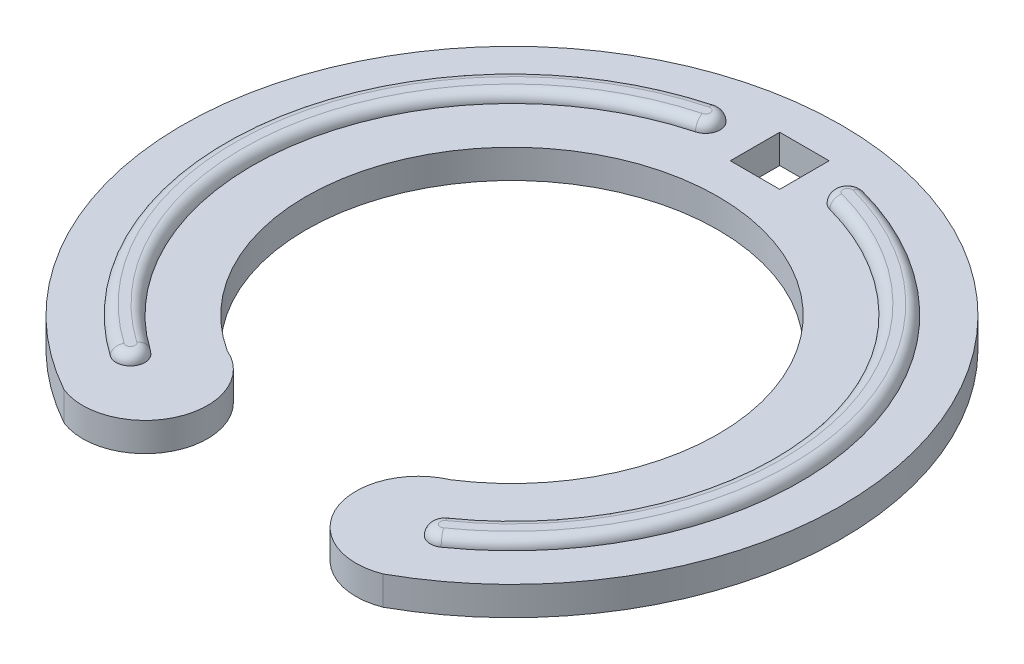
ISO-10303-21;
HEADER;
FILE_DESCRIPTION(('STEP AP214'),'2;1');
FILE_NAME('part.step','',(''),(''),'','','');
FILE_SCHEMA(('AUTOMOTIVE_DESIGN { 1 0 10303 214 1 1 1 1 }'));
ENDSEC;
DATA;
#1=APPLICATION_CONTEXT('core data for automotive mechanical design processes');
#2=APPLICATION_PROTOCOL_DEFINITION('international standard','automotive_design',2000,#1);
#3=PRODUCT_CONTEXT('',#1,'mechanical');
#4=PRODUCT('Part','Part','',(#3));
#5=PRODUCT_RELATED_PRODUCT_CATEGORY('part','',(#4));
#6=PRODUCT_DEFINITION_FORMATION('','',#4);
#7=PRODUCT_DEFINITION_CONTEXT('part definition',#1,'design');
#8=PRODUCT_DEFINITION('design','',#6,#7);
#9=PRODUCT_DEFINITION_SHAPE('','',#8);
#10=(LENGTH_UNIT() NAMED_UNIT(*) SI_UNIT(.MILLI.,.METRE.));
#11=(NAMED_UNIT(*) PLANE_ANGLE_UNIT() SI_UNIT($,.RADIAN.));
#12=(NAMED_UNIT(*) SI_UNIT($,.STERADIAN.) SOLID_ANGLE_UNIT());
#13=UNCERTAINTY_MEASURE_WITH_UNIT(LENGTH_MEASURE(1.E-05),#10,'distance_accuracy_value','');
#14=(GEOMETRIC_REPRESENTATION_CONTEXT(3) GLOBAL_UNCERTAINTY_ASSIGNED_CONTEXT((#13)) GLOBAL_UNIT_ASSIGNED_CONTEXT((#10,
#11,#12)) REPRESENTATION_CONTEXT('',''));
#15=CARTESIAN_POINT('',(0.,0.,0.));
#16=DIRECTION('',(0.,0.,1.));
#17=DIRECTION('',(1.,0.,0.));
#18=AXIS2_PLACEMENT_3D('',#15,#16,#17);
#19=CARTESIAN_POINT('',(-8.29121734406497,3.5,13.9756293222694));
#20=DIRECTION('',(0.,1.,0.));
#21=DIRECTION('',(0.,0.,1.));
#22=AXIS2_PLACEMENT_3D('',#19,#20,#21);
#23=PLANE('',#22);
#24=CARTESIAN_POINT('',(-19.0714165086721,3.5,27.2368054726091));
#25=DIRECTION('',(0.,1.,0.));
#26=DIRECTION('',(0.,0.,-1.));
#27=AXIS2_PLACEMENT_3D('',#24,#25,#26);
#28=CIRCLE('',#27,1.75);
#29=CARTESIAN_POINT('',(-20.0751752722864,3.5,28.6703215501148));
#30=VERTEX_POINT('',#29);
#31=CARTESIAN_POINT('',(-18.0676577450578,3.5,25.8032893951034));
#32=VERTEX_POINT('',#31);
#33=EDGE_CURVE('E175',#30,#32,#28,.T.);
#34=ORIENTED_EDGE('',*,*,#33,.F.);
#35=CARTESIAN_POINT('',(0.,3.5,0.));
#36=DIRECTION('',(0.,1.,0.));
#37=DIRECTION('',(0.,0.,-1.));
#38=AXIS2_PLACEMENT_3D('',#35,#36,#37);
#39=CIRCLE('',#38,35.);
#40=CARTESIAN_POINT('',(-9.05866657858826,3.5,-33.8074039201174));
#41=VERTEX_POINT('',#40);
#42=EDGE_CURVE('E185',#41,#30,#39,.T.);
#43=ORIENTED_EDGE('',*,*,#42,.F.);
#44=CARTESIAN_POINT('',(-8.60573324965875,3.5,-32.1170337241112));
#45=DIRECTION('',(0.,1.,0.));
#46=DIRECTION('',(0.,0.,-1.));
#47=AXIS2_PLACEMENT_3D('',#44,#45,#46);
#48=CIRCLE('',#47,1.75000000000001);
#49=CARTESIAN_POINT('',(-8.15279992072934,3.5,-30.4266635281053));
#50=VERTEX_POINT('',#49);
#51=EDGE_CURVE('E182',#50,#41,#48,.T.);
#52=ORIENTED_EDGE('',*,*,#51,.F.);
#53=CARTESIAN_POINT('',(0.,3.5,0.));
#54=DIRECTION('',(0.,-1.,0.));
#55=DIRECTION('',(0.,0.,-1.));
#56=AXIS2_PLACEMENT_3D('',#53,#54,#55);
#57=CIRCLE('',#56,31.5);
#58=EDGE_CURVE('E178',#32,#50,#57,.T.);
#59=ORIENTED_EDGE('',*,*,#58,.F.);
#60=EDGE_LOOP('',(#34,#43,#52,#59));
#61=FACE_BOUND('',#60,.T.);
#62=CARTESIAN_POINT('',(-16.5824346881299,3.5,27.9512586445388));
#63=DIRECTION('',(0.,1.,0.));
#64=DIRECTION('',(0.,0.,1.));
#65=AXIS2_PLACEMENT_3D('',#62,#63,#64);
#66=CIRCLE('',#65,7.57805786565989);
#67=CARTESIAN_POINT('',(-19.3649167310371,3.5,35.));
#68=VERTEX_POINT('',#67);
#69=CARTESIAN_POINT('',(-13.5646599662505,3.5,21.));
#70=VERTEX_POINT('',#69);
#71=EDGE_CURVE('E220',#68,#70,#66,.T.);
#72=ORIENTED_EDGE('',*,*,#71,.T.);
#73=CARTESIAN_POINT('',(0.,3.5,0.));
#74=DIRECTION('',(0.,-1.,0.));
#75=DIRECTION('',(0.,0.,1.));
#76=AXIS2_PLACEMENT_3D('',#73,#74,#75);
#77=CIRCLE('',#76,25.);
#78=CARTESIAN_POINT('',(13.5646599662505,3.5,21.));
#79=VERTEX_POINT('',#78);
#80=EDGE_CURVE('E223',#70,#79,#77,.T.);
#81=ORIENTED_EDGE('',*,*,#80,.T.);
#82=CARTESIAN_POINT('',(16.5824346881299,3.5,27.9512586445388));
#83=DIRECTION('',(0.,1.,0.));
#84=DIRECTION('',(0.,0.,-1.));
#85=AXIS2_PLACEMENT_3D('',#82,#83,#84);
#86=CIRCLE('',#85,7.57805786565989);
#87=CARTESIAN_POINT('',(19.3649167310371,3.5,35.));
#88=VERTEX_POINT('',#87);
#89=EDGE_CURVE('E226',#79,#88,#86,.T.);
#90=ORIENTED_EDGE('',*,*,#89,.T.);
#91=CARTESIAN_POINT('',(0.,3.5,0.));
#92=DIRECTION('',(0.,1.,0.));
#93=DIRECTION('',(0.,0.,1.));
#94=AXIS2_PLACEMENT_3D('',#91,#92,#93);
#95=CIRCLE('',#94,40.);
#96=EDGE_CURVE('E228',#88,#68,#95,.T.);
#97=ORIENTED_EDGE('',*,*,#96,.T.);
#98=EDGE_LOOP('',(#72,#81,#90,#97));
#99=FACE_BOUND('',#98,.T.);
#100=DIRECTION('',(1.,0.,0.));
#101=VECTOR('',#100,1.);
#102=CARTESIAN_POINT('',(-3.,3.5,-29.5));
#103=LINE('',#102,#101);
#104=CARTESIAN_POINT('',(-3.,3.5,-29.5));
#105=VERTEX_POINT('',#104);
#106=CARTESIAN_POINT('',(3.,3.5,-29.5));
#107=VERTEX_POINT('',#106);
#108=EDGE_CURVE('E191',#105,#107,#103,.T.);
#109=ORIENTED_EDGE('',*,*,#108,.F.);
#110=DIRECTION('',(0.,0.,1.));
#111=VECTOR('',#110,1.);
#112=CARTESIAN_POINT('',(-3.,3.5,-35.5));
#113=LINE('',#112,#111);
#114=CARTESIAN_POINT('',(-3.,3.5,-35.5));
#115=VERTEX_POINT('',#114);
#116=EDGE_CURVE('E189',#115,#105,#113,.T.);
#117=ORIENTED_EDGE('',*,*,#116,.F.);
#118=DIRECTION('',(-1.,0.,0.));
#119=VECTOR('',#118,1.);
#120=CARTESIAN_POINT('',(-3.,3.5,-35.5));
#121=LINE('',#120,#119);
#122=CARTESIAN_POINT('',(3.,3.5,-35.5));
#123=VERTEX_POINT('',#122);
#124=EDGE_CURVE('E197',#123,#115,#121,.T.);
#125=ORIENTED_EDGE('',*,*,#124,.F.);
#126=DIRECTION('',(0.,0.,-1.));
#127=VECTOR('',#126,1.);
#128=CARTESIAN_POINT('',(3.,3.5,-35.5));
#129=LINE('',#128,#127);
#130=EDGE_CURVE('E194',#107,#123,#129,.T.);
#131=ORIENTED_EDGE('',*,*,#130,.F.);
#132=EDGE_LOOP('',(#109,#117,#125,#131));
#133=FACE_BOUND('',#132,.T.);
#134=CARTESIAN_POINT('',(19.0714165086721,3.5,27.2368054726091));
#135=DIRECTION('',(0.,-1.,0.));
#136=DIRECTION('',(0.,0.,-1.));
#137=AXIS2_PLACEMENT_3D('',#134,#135,#136);
#138=CIRCLE('',#137,1.75);
#139=CARTESIAN_POINT('',(20.0751752722864,3.5,28.6703215501148));
#140=VERTEX_POINT('',#139);
#141=CARTESIAN_POINT('',(18.0676577450578,3.5,25.8032893951034));
#142=VERTEX_POINT('',#141);
#143=EDGE_CURVE('E146',#140,#142,#138,.T.);
#144=ORIENTED_EDGE('',*,*,#143,.T.);
#145=CARTESIAN_POINT('',(0.,3.5,0.));
#146=DIRECTION('',(0.,1.,0.));
#147=DIRECTION('',(0.,0.,-1.));
#148=AXIS2_PLACEMENT_3D('',#145,#146,#147);
#149=CIRCLE('',#148,31.5);
#150=CARTESIAN_POINT('',(8.15279992072943,3.5,-30.4266635281056));
#151=VERTEX_POINT('',#150);
#152=EDGE_CURVE('E149',#142,#151,#149,.T.);
#153=ORIENTED_EDGE('',*,*,#152,.T.);
#154=CARTESIAN_POINT('',(8.60573324965875,3.5,-32.1170337241112));
#155=DIRECTION('',(0.,-1.,0.));
#156=DIRECTION('',(0.,0.,-1.));
#157=AXIS2_PLACEMENT_3D('',#154,#155,#156);
#158=CIRCLE('',#157,1.75000000000001);
#159=CARTESIAN_POINT('',(9.05866657858817,3.5,-33.8074039201171));
#160=VERTEX_POINT('',#159);
#161=EDGE_CURVE('E168',#151,#160,#158,.T.);
#162=ORIENTED_EDGE('',*,*,#161,.T.);
#163=CARTESIAN_POINT('',(0.,3.5,0.));
#164=DIRECTION('',(0.,-1.,0.));
#165=DIRECTION('',(0.,0.,-1.));
#166=AXIS2_PLACEMENT_3D('',#163,#164,#165);
#167=CIRCLE('',#166,35.);
#168=EDGE_CURVE('E151',#160,#140,#167,.T.);
#169=ORIENTED_EDGE('',*,*,#168,.T.);
#170=EDGE_LOOP('',(#144,#153,#162,#169));
#171=FACE_BOUND('',#170,.T.);
#172=ADVANCED_FACE('F33',(#61,#99,#133,#171),#23,.T.);
#173=CARTESIAN_POINT('',(-8.29121734406497,0.,13.9756293222694));
#174=DIRECTION('',(0.,1.,0.));
#175=DIRECTION('',(0.,0.,1.));
#176=AXIS2_PLACEMENT_3D('',#173,#174,#175);
#177=PLANE('',#176);
#178=CARTESIAN_POINT('',(-16.5824346881299,0.,27.9512586445388));
#179=DIRECTION('',(0.,1.,0.));
#180=DIRECTION('',(0.,0.,1.));
#181=AXIS2_PLACEMENT_3D('',#178,#179,#180);
#182=CIRCLE('',#181,7.57805786565989);
#183=CARTESIAN_POINT('',(-19.3649167310371,0.,35.));
#184=VERTEX_POINT('',#183);
#185=CARTESIAN_POINT('',(-13.5646599662505,0.,21.));
#186=VERTEX_POINT('',#185);
#187=EDGE_CURVE('E219',#184,#186,#182,.T.);
#188=ORIENTED_EDGE('',*,*,#187,.F.);
#189=CARTESIAN_POINT('',(0.,0.,0.));
#190=DIRECTION('',(0.,1.,0.));
#191=DIRECTION('',(0.,0.,1.));
#192=AXIS2_PLACEMENT_3D('',#189,#190,#191);
#193=CIRCLE('',#192,40.);
#194=CARTESIAN_POINT('',(19.3649167310371,0.,35.));
#195=VERTEX_POINT('',#194);
#196=EDGE_CURVE('E224',#195,#184,#193,.T.);
#197=ORIENTED_EDGE('',*,*,#196,.F.);
#198=CARTESIAN_POINT('',(16.5824346881299,0.,27.9512586445388));
#199=DIRECTION('',(0.,1.,0.));
#200=DIRECTION('',(0.,0.,-1.));
#201=AXIS2_PLACEMENT_3D('',#198,#199,#200);
#202=CIRCLE('',#201,7.57805786565989);
#203=CARTESIAN_POINT('',(13.5646599662505,0.,21.));
#204=VERTEX_POINT('',#203);
#205=EDGE_CURVE('E235',#204,#195,#202,.T.);
#206=ORIENTED_EDGE('',*,*,#205,.F.);
#207=CARTESIAN_POINT('',(0.,0.,0.));
#208=DIRECTION('',(0.,-1.,0.));
#209=DIRECTION('',(0.,0.,1.));
#210=AXIS2_PLACEMENT_3D('',#207,#208,#209);
#211=CIRCLE('',#210,25.);
#212=EDGE_CURVE('E233',#186,#204,#211,.T.);
#213=ORIENTED_EDGE('',*,*,#212,.F.);
#214=EDGE_LOOP('',(#188,#197,#206,#213));
#215=FACE_BOUND('',#214,.T.);
#216=DIRECTION('',(0.,0.,1.));
#217=VECTOR('',#216,1.);
#218=CARTESIAN_POINT('',(-3.,0.,-35.5));
#219=LINE('',#218,#217);
#220=CARTESIAN_POINT('',(-3.,0.,-35.5));
#221=VERTEX_POINT('',#220);
#222=CARTESIAN_POINT('',(-3.,0.,-29.5));
#223=VERTEX_POINT('',#222);
#224=EDGE_CURVE('E188',#221,#223,#219,.T.);
#225=ORIENTED_EDGE('',*,*,#224,.T.);
#226=DIRECTION('',(1.,0.,0.));
#227=VECTOR('',#226,1.);
#228=CARTESIAN_POINT('',(-3.,0.,-29.5));
#229=LINE('',#228,#227);
#230=CARTESIAN_POINT('',(3.,0.,-29.5));
#231=VERTEX_POINT('',#230);
#232=EDGE_CURVE('E202',#223,#231,#229,.T.);
#233=ORIENTED_EDGE('',*,*,#232,.T.);
#234=DIRECTION('',(0.,0.,-1.));
#235=VECTOR('',#234,1.);
#236=CARTESIAN_POINT('',(3.,0.,-35.5));
#237=LINE('',#236,#235);
#238=CARTESIAN_POINT('',(3.,0.,-35.5));
#239=VERTEX_POINT('',#238);
#240=EDGE_CURVE('E205',#231,#239,#237,.T.);
#241=ORIENTED_EDGE('',*,*,#240,.T.);
#242=DIRECTION('',(-1.,0.,0.));
#243=VECTOR('',#242,1.);
#244=CARTESIAN_POINT('',(-3.,0.,-35.5));
#245=LINE('',#244,#243);
#246=EDGE_CURVE('E192',#239,#221,#245,.T.);
#247=ORIENTED_EDGE('',*,*,#246,.T.);
#248=EDGE_LOOP('',(#225,#233,#241,#247));
#249=FACE_BOUND('',#248,.T.);
#250=ADVANCED_FACE('F279',(#215,#249),#177,.F.);
#251=CARTESIAN_POINT('',(-16.5824346881299,3.5,27.9512586445388));
#252=DIRECTION('',(0.,-1.,0.));
#253=DIRECTION('',(0.,0.,-1.));
#254=AXIS2_PLACEMENT_3D('',#251,#252,#253);
#255=CYLINDRICAL_SURFACE('',#254,7.57805786565989);
#256=ORIENTED_EDGE('',*,*,#187,.T.);
#257=DIRECTION('',(0.,-1.,0.));
#258=VECTOR('',#257,1.);
#259=CARTESIAN_POINT('',(-13.5646599662505,3.5,21.));
#260=LINE('',#259,#258);
#261=EDGE_CURVE('E246',#70,#186,#260,.T.);
#262=ORIENTED_EDGE('',*,*,#261,.F.);
#263=ORIENTED_EDGE('',*,*,#71,.F.);
#264=DIRECTION('',(0.,-1.,0.));
#265=VECTOR('',#264,1.);
#266=CARTESIAN_POINT('',(-19.3649167310371,3.5,35.));
#267=LINE('',#266,#265);
#268=EDGE_CURVE('E230',#68,#184,#267,.T.);
#269=ORIENTED_EDGE('',*,*,#268,.T.);
#270=EDGE_LOOP('',(#256,#262,#263,#269));
#271=FACE_BOUND('',#270,.T.);
#272=ADVANCED_FACE('F285',(#271),#255,.T.);
#273=CARTESIAN_POINT('',(0.,3.5,0.));
#274=DIRECTION('',(0.,-1.,0.));
#275=DIRECTION('',(0.,0.,-1.));
#276=AXIS2_PLACEMENT_3D('',#273,#274,#275);
#277=CYLINDRICAL_SURFACE('',#276,25.);
#278=ORIENTED_EDGE('',*,*,#212,.T.);
#279=DIRECTION('',(0.,-1.,0.));
#280=VECTOR('',#279,1.);
#281=CARTESIAN_POINT('',(13.5646599662505,3.5,21.));
#282=LINE('',#281,#280);
#283=EDGE_CURVE('E243',#79,#204,#282,.T.);
#284=ORIENTED_EDGE('',*,*,#283,.F.);
#285=ORIENTED_EDGE('',*,*,#80,.F.);
#286=ORIENTED_EDGE('',*,*,#261,.T.);
#287=EDGE_LOOP('',(#278,#284,#285,#286));
#288=FACE_BOUND('',#287,.T.);
#289=ADVANCED_FACE('F300',(#288),#277,.F.);
#290=CARTESIAN_POINT('',(16.5824346881299,3.5,27.9512586445388));
#291=DIRECTION('',(0.,-1.,0.));
#292=DIRECTION('',(0.,0.,-1.));
#293=AXIS2_PLACEMENT_3D('',#290,#291,#292);
#294=CYLINDRICAL_SURFACE('',#293,7.57805786565989);
#295=ORIENTED_EDGE('',*,*,#205,.T.);
#296=DIRECTION('',(0.,-1.,0.));
#297=VECTOR('',#296,1.);
#298=CARTESIAN_POINT('',(19.3649167310371,3.5,35.));
#299=LINE('',#298,#297);
#300=EDGE_CURVE('E240',#88,#195,#299,.T.);
#301=ORIENTED_EDGE('',*,*,#300,.F.);
#302=ORIENTED_EDGE('',*,*,#89,.F.);
#303=ORIENTED_EDGE('',*,*,#283,.T.);
#304=EDGE_LOOP('',(#295,#301,#302,#303));
#305=FACE_BOUND('',#304,.T.);
#306=ADVANCED_FACE('F296',(#305),#294,.T.);
#307=CARTESIAN_POINT('',(0.,3.5,0.));
#308=DIRECTION('',(0.,-1.,0.));
#309=DIRECTION('',(0.,0.,-1.));
#310=AXIS2_PLACEMENT_3D('',#307,#308,#309);
#311=CYLINDRICAL_SURFACE('',#310,40.);
#312=ORIENTED_EDGE('',*,*,#196,.T.);
#313=ORIENTED_EDGE('',*,*,#268,.F.);
#314=ORIENTED_EDGE('',*,*,#96,.F.);
#315=ORIENTED_EDGE('',*,*,#300,.T.);
#316=EDGE_LOOP('',(#312,#313,#314,#315));
#317=FACE_BOUND('',#316,.T.);
#318=ADVANCED_FACE('F293',(#317),#311,.T.);
#319=CARTESIAN_POINT('',(-3.,3.5,-35.5));
#320=DIRECTION('',(1.,0.,0.));
#321=DIRECTION('',(0.,0.,-1.));
#322=AXIS2_PLACEMENT_3D('',#319,#320,#321);
#323=PLANE('',#322);
#324=ORIENTED_EDGE('',*,*,#224,.F.);
#325=DIRECTION('',(0.,-1.,0.));
#326=VECTOR('',#325,1.);
#327=CARTESIAN_POINT('',(-3.,3.5,-35.5));
#328=LINE('',#327,#326);
#329=EDGE_CURVE('E199',#115,#221,#328,.T.);
#330=ORIENTED_EDGE('',*,*,#329,.F.);
#331=ORIENTED_EDGE('',*,*,#116,.T.);
#332=DIRECTION('',(0.,-1.,0.));
#333=VECTOR('',#332,1.);
#334=CARTESIAN_POINT('',(-3.,3.5,-29.5));
#335=LINE('',#334,#333);
#336=EDGE_CURVE('E216',#105,#223,#335,.T.);
#337=ORIENTED_EDGE('',*,*,#336,.T.);
#338=EDGE_LOOP('',(#324,#330,#331,#337));
#339=FACE_BOUND('',#338,.T.);
#340=ADVANCED_FACE('F290',(#339),#323,.T.);
#341=CARTESIAN_POINT('',(-3.,3.5,-29.5));
#342=DIRECTION('',(0.,0.,-1.));
#343=DIRECTION('',(-1.,0.,0.));
#344=AXIS2_PLACEMENT_3D('',#341,#342,#343);
#345=PLANE('',#344);
#346=ORIENTED_EDGE('',*,*,#232,.F.);
#347=ORIENTED_EDGE('',*,*,#336,.F.);
#348=ORIENTED_EDGE('',*,*,#108,.T.);
#349=DIRECTION('',(0.,-1.,0.));
#350=VECTOR('',#349,1.);
#351=CARTESIAN_POINT('',(3.,3.5,-29.5));
#352=LINE('',#351,#350);
#353=EDGE_CURVE('E214',#107,#231,#352,.T.);
#354=ORIENTED_EDGE('',*,*,#353,.T.);
#355=EDGE_LOOP('',(#346,#347,#348,#354));
#356=FACE_BOUND('',#355,.T.);
#357=ADVANCED_FACE('F349',(#356),#345,.T.);
#358=CARTESIAN_POINT('',(3.,3.5,-35.5));
#359=DIRECTION('',(-1.,0.,0.));
#360=DIRECTION('',(0.,0.,1.));
#361=AXIS2_PLACEMENT_3D('',#358,#359,#360);
#362=PLANE('',#361);
#363=ORIENTED_EDGE('',*,*,#240,.F.);
#364=ORIENTED_EDGE('',*,*,#353,.F.);
#365=ORIENTED_EDGE('',*,*,#130,.T.);
#366=DIRECTION('',(0.,-1.,0.));
#367=VECTOR('',#366,1.);
#368=CARTESIAN_POINT('',(3.,3.5,-35.5));
#369=LINE('',#368,#367);
#370=EDGE_CURVE('E212',#123,#239,#369,.T.);
#371=ORIENTED_EDGE('',*,*,#370,.T.);
#372=EDGE_LOOP('',(#363,#364,#365,#371));
#373=FACE_BOUND('',#372,.T.);
#374=ADVANCED_FACE('F343',(#373),#362,.T.);
#375=CARTESIAN_POINT('',(-3.,3.5,-35.5));
#376=DIRECTION('',(0.,0.,1.));
#377=DIRECTION('',(1.,0.,0.));
#378=AXIS2_PLACEMENT_3D('',#375,#376,#377);
#379=PLANE('',#378);
#380=ORIENTED_EDGE('',*,*,#246,.F.);
#381=ORIENTED_EDGE('',*,*,#370,.F.);
#382=ORIENTED_EDGE('',*,*,#124,.T.);
#383=ORIENTED_EDGE('',*,*,#329,.T.);
#384=EDGE_LOOP('',(#380,#381,#382,#383));
#385=FACE_BOUND('',#384,.T.);
#386=ADVANCED_FACE('F328',(#385),#379,.T.);
#387=CARTESIAN_POINT('',(-9.53570825433606,4.7,13.6184027363045));
#388=DIRECTION('',(0.,-1.,0.));
#389=DIRECTION('',(0.,0.,-1.));
#390=AXIS2_PLACEMENT_3D('',#387,#388,#389);
#391=PLANE('',#390);
#392=CARTESIAN_POINT('',(-8.60573324965875,4.7,-32.1170337241112));
#393=DIRECTION('',(0.,-1.,0.));
#394=DIRECTION('',(0.,0.,-1.));
#395=AXIS2_PLACEMENT_3D('',#392,#393,#394);
#396=CIRCLE('',#395,0.550000000000006);
#397=CARTESIAN_POINT('',(-8.46338277485245,4.7,-31.5857745196525));
#398=VERTEX_POINT('',#397);
#399=CARTESIAN_POINT('',(-8.74808372446514,4.7,-32.6482929285702));
#400=VERTEX_POINT('',#399);
#401=EDGE_CURVE('E253',#398,#400,#396,.F.);
#402=ORIENTED_EDGE('',*,*,#401,.T.);
#403=CARTESIAN_POINT('',(0.,4.7,0.));
#404=DIRECTION('',(0.,-1.,0.));
#405=DIRECTION('',(0.,0.,-1.));
#406=AXIS2_PLACEMENT_3D('',#403,#404,#405);
#407=CIRCLE('',#406,33.8);
#408=CARTESIAN_POINT('',(-19.3868835486652,4.7,27.687339096968));
#409=VERTEX_POINT('',#408);
#410=EDGE_CURVE('E255',#400,#409,#407,.F.);
#411=ORIENTED_EDGE('',*,*,#410,.T.);
#412=CARTESIAN_POINT('',(-19.0714165086721,4.7,27.2368054726091));
#413=DIRECTION('',(0.,-1.,0.));
#414=DIRECTION('',(0.,0.,-1.));
#415=AXIS2_PLACEMENT_3D('',#412,#413,#414);
#416=CIRCLE('',#415,0.550000000000002);
#417=CARTESIAN_POINT('',(-18.755949468679,4.7,26.7862718482501));
#418=VERTEX_POINT('',#417);
#419=EDGE_CURVE('E249',#409,#418,#416,.F.);
#420=ORIENTED_EDGE('',*,*,#419,.T.);
#421=CARTESIAN_POINT('',(0.,4.7,0.));
#422=DIRECTION('',(0.,-1.,0.));
#423=DIRECTION('',(0.,0.,-1.));
#424=AXIS2_PLACEMENT_3D('',#421,#422,#423);
#425=CIRCLE('',#424,32.7);
#426=EDGE_CURVE('E251',#418,#398,#425,.T.);
#427=ORIENTED_EDGE('',*,*,#426,.T.);
#428=EDGE_LOOP('',(#402,#411,#420,#427));
#429=FACE_BOUND('',#428,.T.);
#430=ADVANCED_FACE('F323',(#429),#391,.F.);
#431=CARTESIAN_POINT('',(0.,3.5,0.));
#432=DIRECTION('',(0.,-1.,0.));
#433=DIRECTION('',(0.,0.,-1.));
#434=AXIS2_PLACEMENT_3D('',#431,#432,#433);
#435=TOROIDAL_SURFACE('',#434,32.7,1.2);
#436=CARTESIAN_POINT('',(-18.755949468679,3.5,26.7862718482501));
#437=DIRECTION('',(0.819152044288995,0.,0.573576436351041));
#438=DIRECTION('',(0.573576436351041,0.,-0.819152044288995));
#439=AXIS2_PLACEMENT_3D('',#436,#437,#438);
#440=CIRCLE('',#439,1.2);
#441=EDGE_CURVE('E259',#32,#418,#440,.T.);
#442=ORIENTED_EDGE('',*,*,#441,.F.);
#443=ORIENTED_EDGE('',*,*,#58,.T.);
#444=CARTESIAN_POINT('',(-8.46338277485245,3.5,-31.5857745196525));
#445=DIRECTION('',(0.965925826289068,0.,-0.258819045102523));
#446=DIRECTION('',(-0.258819045102523,0.,-0.965925826289068));
#447=AXIS2_PLACEMENT_3D('',#444,#445,#446);
#448=CIRCLE('',#447,1.2);
#449=EDGE_CURVE('E179',#398,#50,#448,.T.);
#450=ORIENTED_EDGE('',*,*,#449,.F.);
#451=ORIENTED_EDGE('',*,*,#426,.F.);
#452=EDGE_LOOP('',(#442,#443,#450,#451));
#453=FACE_BOUND('',#452,.T.);
#454=ADVANCED_FACE('F320',(#453),#435,.T.);
#455=CARTESIAN_POINT('',(-8.60573324965875,3.5,-32.1170337241112));
#456=DIRECTION('',(0.,-1.,0.));
#457=DIRECTION('',(0.,0.,-1.));
#458=AXIS2_PLACEMENT_3D('',#455,#456,#457);
#459=DEGENERATE_TOROIDAL_SURFACE('',#458,0.550000000000006,1.2,.T.);
#460=ORIENTED_EDGE('',*,*,#449,.T.);
#461=ORIENTED_EDGE('',*,*,#51,.T.);
#462=CARTESIAN_POINT('',(-8.74808372446514,3.5,-32.6482929285702));
#463=DIRECTION('',(-0.965925826289068,0.,0.258819045102521));
#464=DIRECTION('',(0.258819045102521,0.,0.965925826289068));
#465=AXIS2_PLACEMENT_3D('',#462,#463,#464);
#466=CIRCLE('',#465,1.2);
#467=EDGE_CURVE('E170',#400,#41,#466,.T.);
#468=ORIENTED_EDGE('',*,*,#467,.F.);
#469=ORIENTED_EDGE('',*,*,#401,.F.);
#470=EDGE_LOOP('',(#460,#461,#468,#469));
#471=FACE_BOUND('',#470,.T.);
#472=ADVANCED_FACE('F316',(#471),#459,.T.);
#473=CARTESIAN_POINT('',(-19.0714165086721,3.5,27.2368054726091));
#474=DIRECTION('',(0.,-1.,0.));
#475=DIRECTION('',(0.,0.,-1.));
#476=AXIS2_PLACEMENT_3D('',#473,#474,#475);
#477=DEGENERATE_TOROIDAL_SURFACE('',#476,0.550000000000002,1.2,.T.);
#478=ORIENTED_EDGE('',*,*,#441,.T.);
#479=ORIENTED_EDGE('',*,*,#419,.F.);
#480=CARTESIAN_POINT('',(-19.3868835486652,3.5,27.687339096968));
#481=DIRECTION('',(-0.819152044289,0.,-0.573576436351034));
#482=DIRECTION('',(-0.573576436351034,0.,0.819152044289));
#483=AXIS2_PLACEMENT_3D('',#480,#481,#482);
#484=CIRCLE('',#483,1.2);
#485=EDGE_CURVE('E167',#30,#409,#484,.T.);
#486=ORIENTED_EDGE('',*,*,#485,.F.);
#487=ORIENTED_EDGE('',*,*,#33,.T.);
#488=EDGE_LOOP('',(#478,#479,#486,#487));
#489=FACE_BOUND('',#488,.T.);
#490=ADVANCED_FACE('F312',(#489),#477,.T.);
#491=CARTESIAN_POINT('',(0.,3.5,0.));
#492=DIRECTION('',(0.,-1.,0.));
#493=DIRECTION('',(0.,0.,-1.));
#494=AXIS2_PLACEMENT_3D('',#491,#492,#493);
#495=TOROIDAL_SURFACE('',#494,33.8,1.2);
#496=ORIENTED_EDGE('',*,*,#467,.T.);
#497=ORIENTED_EDGE('',*,*,#42,.T.);
#498=ORIENTED_EDGE('',*,*,#485,.T.);
#499=ORIENTED_EDGE('',*,*,#410,.F.);
#500=EDGE_LOOP('',(#496,#497,#498,#499));
#501=FACE_BOUND('',#500,.T.);
#502=ADVANCED_FACE('F308',(#501),#495,.T.);
#503=CARTESIAN_POINT('',(9.53570825433606,4.7,13.6184027363045));
#504=DIRECTION('',(0.,-1.,0.));
#505=DIRECTION('',(0.,0.,-1.));
#506=AXIS2_PLACEMENT_3D('',#503,#504,#505);
#507=PLANE('',#506);
#508=CARTESIAN_POINT('',(8.60573324965875,4.7,-32.1170337241112));
#509=DIRECTION('',(0.,-1.,0.));
#510=DIRECTION('',(0.,0.,-1.));
#511=AXIS2_PLACEMENT_3D('',#508,#509,#510);
#512=CIRCLE('',#511,0.550000000000006);
#513=CARTESIAN_POINT('',(8.74808372446523,4.7,-32.6482929285705));
#514=VERTEX_POINT('',#513);
#515=CARTESIAN_POINT('',(8.46338277485236,4.7,-31.5857745196522));
#516=VERTEX_POINT('',#515);
#517=EDGE_CURVE('E42',#514,#516,#512,.F.);
#518=ORIENTED_EDGE('',*,*,#517,.T.);
#519=CARTESIAN_POINT('',(0.,4.7,0.));
#520=DIRECTION('',(0.,-1.,0.));
#521=DIRECTION('',(0.,0.,-1.));
#522=AXIS2_PLACEMENT_3D('',#519,#520,#521);
#523=CIRCLE('',#522,32.7);
#524=CARTESIAN_POINT('',(18.755949468679,4.7,26.7862718482501));
#525=VERTEX_POINT('',#524);
#526=EDGE_CURVE('E11',#516,#525,#523,.T.);
#527=ORIENTED_EDGE('',*,*,#526,.T.);
#528=CARTESIAN_POINT('',(19.0714165086721,4.7,27.2368054726091));
#529=DIRECTION('',(0.,-1.,0.));
#530=DIRECTION('',(0.,0.,-1.));
#531=AXIS2_PLACEMENT_3D('',#528,#529,#530);
#532=CIRCLE('',#531,0.550000000000002);
#533=CARTESIAN_POINT('',(19.3868835486652,4.7,27.687339096968));
#534=VERTEX_POINT('',#533);
#535=EDGE_CURVE('E159',#525,#534,#532,.F.);
#536=ORIENTED_EDGE('',*,*,#535,.T.);
#537=CARTESIAN_POINT('',(0.,4.7,0.));
#538=DIRECTION('',(0.,-1.,0.));
#539=DIRECTION('',(0.,0.,-1.));
#540=AXIS2_PLACEMENT_3D('',#537,#538,#539);
#541=CIRCLE('',#540,33.8);
#542=EDGE_CURVE('E53',#534,#514,#541,.F.);
#543=ORIENTED_EDGE('',*,*,#542,.T.);
#544=EDGE_LOOP('',(#518,#527,#536,#543));
#545=FACE_BOUND('',#544,.T.);
#546=ADVANCED_FACE('F311',(#545),#507,.F.);
#547=CARTESIAN_POINT('',(0.,3.5,0.));
#548=DIRECTION('',(0.,-1.,0.));
#549=DIRECTION('',(0.,0.,-1.));
#550=AXIS2_PLACEMENT_3D('',#547,#548,#549);
#551=TOROIDAL_SURFACE('',#550,33.8,1.2);
#552=CARTESIAN_POINT('',(8.74808372446523,3.5,-32.6482929285705));
#553=DIRECTION('',(-0.965925826289068,0.,-0.258819045102522));
#554=DIRECTION('',(-0.258819045102523,0.,0.965925826289068));
#555=AXIS2_PLACEMENT_3D('',#552,#553,#554);
#556=CIRCLE('',#555,1.2);
#557=EDGE_CURVE('E161',#514,#160,#556,.T.);
#558=ORIENTED_EDGE('',*,*,#557,.F.);
#559=ORIENTED_EDGE('',*,*,#542,.F.);
#560=CARTESIAN_POINT('',(19.3868835486652,3.5,27.687339096968));
#561=DIRECTION('',(-0.819152044288995,0.,0.573576436351041));
#562=DIRECTION('',(0.573576436351041,0.,0.819152044288995));
#563=AXIS2_PLACEMENT_3D('',#560,#561,#562);
#564=CIRCLE('',#563,1.2);
#565=EDGE_CURVE('E37',#140,#534,#564,.T.);
#566=ORIENTED_EDGE('',*,*,#565,.F.);
#567=ORIENTED_EDGE('',*,*,#168,.F.);
#568=EDGE_LOOP('',(#558,#559,#566,#567));
#569=FACE_BOUND('',#568,.T.);
#570=ADVANCED_FACE('F35',(#569),#551,.T.);
#571=CARTESIAN_POINT('',(19.0714165086721,3.5,27.2368054726091));
#572=DIRECTION('',(0.,-1.,0.));
#573=DIRECTION('',(0.,0.,-1.));
#574=AXIS2_PLACEMENT_3D('',#571,#572,#573);
#575=DEGENERATE_TOROIDAL_SURFACE('',#574,0.550000000000002,1.2,.T.);
#576=ORIENTED_EDGE('',*,*,#565,.T.);
#577=ORIENTED_EDGE('',*,*,#535,.F.);
#578=CARTESIAN_POINT('',(18.755949468679,3.5,26.7862718482501));
#579=DIRECTION('',(0.819152044288993,0.,-0.573576436351045));
#580=DIRECTION('',(-0.573576436351045,0.,-0.819152044288993));
#581=AXIS2_PLACEMENT_3D('',#578,#579,#580);
#582=CIRCLE('',#581,1.2);
#583=EDGE_CURVE('E157',#142,#525,#582,.T.);
#584=ORIENTED_EDGE('',*,*,#583,.F.);
#585=ORIENTED_EDGE('',*,*,#143,.F.);
#586=EDGE_LOOP('',(#576,#577,#584,#585));
#587=FACE_BOUND('',#586,.T.);
#588=ADVANCED_FACE('F158',(#587),#575,.T.);
#589=CARTESIAN_POINT('',(8.60573324965875,3.5,-32.1170337241112));
#590=DIRECTION('',(0.,-1.,0.));
#591=DIRECTION('',(0.,0.,-1.));
#592=AXIS2_PLACEMENT_3D('',#589,#590,#591);
#593=DEGENERATE_TOROIDAL_SURFACE('',#592,0.550000000000006,1.2,.T.);
#594=ORIENTED_EDGE('',*,*,#557,.T.);
#595=ORIENTED_EDGE('',*,*,#161,.F.);
#596=CARTESIAN_POINT('',(8.46338277485236,3.5,-31.5857745196522));
#597=DIRECTION('',(0.965925826289068,0.,0.258819045102521));
#598=DIRECTION('',(0.258819045102521,0.,-0.965925826289068));
#599=AXIS2_PLACEMENT_3D('',#596,#597,#598);
#600=CIRCLE('',#599,1.2);
#601=EDGE_CURVE('E162',#516,#151,#600,.T.);
#602=ORIENTED_EDGE('',*,*,#601,.F.);
#603=ORIENTED_EDGE('',*,*,#517,.F.);
#604=EDGE_LOOP('',(#594,#595,#602,#603));
#605=FACE_BOUND('',#604,.T.);
#606=ADVANCED_FACE('F270',(#605),#593,.T.);
#607=CARTESIAN_POINT('',(0.,3.5,0.));
#608=DIRECTION('',(0.,-1.,0.));
#609=DIRECTION('',(0.,0.,-1.));
#610=AXIS2_PLACEMENT_3D('',#607,#608,#609);
#611=TOROIDAL_SURFACE('',#610,32.7,1.2);
#612=ORIENTED_EDGE('',*,*,#583,.T.);
#613=ORIENTED_EDGE('',*,*,#526,.F.);
#614=ORIENTED_EDGE('',*,*,#601,.T.);
#615=ORIENTED_EDGE('',*,*,#152,.F.);
#616=EDGE_LOOP('',(#612,#613,#614,#615));
#617=FACE_BOUND('',#616,.T.);
#618=ADVANCED_FACE('F164',(#617),#611,.T.);
#619=CLOSED_SHELL('',(#172,#250,#272,#289,#306,#318,#340,#357,#374,#386,#430,#454,#472,#490,
#502,#546,#570,#588,#606,#618));
#620=MANIFOLD_SOLID_BREP('B2',#619);
#621=ADVANCED_BREP_SHAPE_REPRESENTATION('',(#18,#620),#14);
#622=SHAPE_DEFINITION_REPRESENTATION(#9,#621);
ENDSEC;
END-ISO-10303-21;
